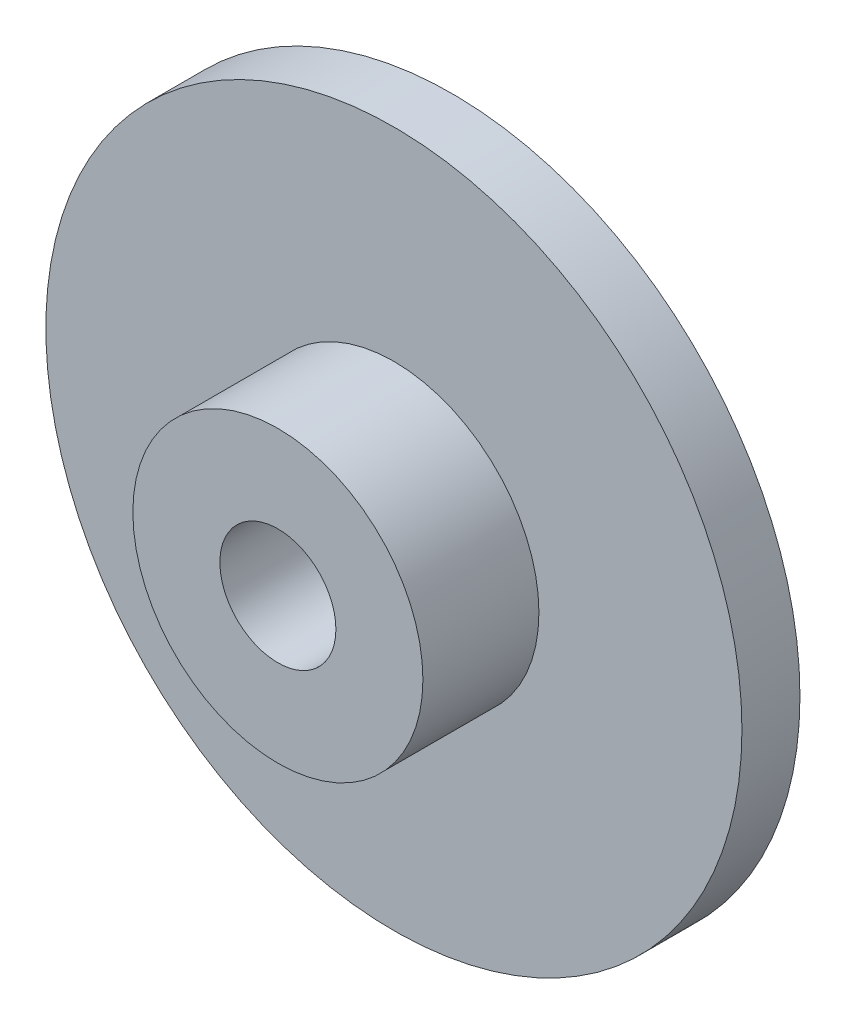
ISO-10303-21;
HEADER;
FILE_DESCRIPTION(('STEP AP214'),'2;1');
FILE_NAME('part.step','',(''),(''),'','','');
FILE_SCHEMA(('AUTOMOTIVE_DESIGN { 1 0 10303 214 1 1 1 1 }'));
ENDSEC;
DATA;
#1=APPLICATION_CONTEXT('core data for automotive mechanical design processes');
#2=APPLICATION_PROTOCOL_DEFINITION('international standard','automotive_design',2000,#1);
#3=PRODUCT_CONTEXT('',#1,'mechanical');
#4=PRODUCT('Part','Part','',(#3));
#5=PRODUCT_RELATED_PRODUCT_CATEGORY('part','',(#4));
#6=PRODUCT_DEFINITION_FORMATION('','',#4);
#7=PRODUCT_DEFINITION_CONTEXT('part definition',#1,'design');
#8=PRODUCT_DEFINITION('design','',#6,#7);
#9=PRODUCT_DEFINITION_SHAPE('','',#8);
#10=(LENGTH_UNIT() NAMED_UNIT(*) SI_UNIT(.MILLI.,.METRE.));
#11=(NAMED_UNIT(*) PLANE_ANGLE_UNIT() SI_UNIT($,.RADIAN.));
#12=(NAMED_UNIT(*) SI_UNIT($,.STERADIAN.) SOLID_ANGLE_UNIT());
#13=UNCERTAINTY_MEASURE_WITH_UNIT(LENGTH_MEASURE(1.E-05),#10,'distance_accuracy_value','');
#14=(GEOMETRIC_REPRESENTATION_CONTEXT(3) GLOBAL_UNCERTAINTY_ASSIGNED_CONTEXT((#13)) GLOBAL_UNIT_ASSIGNED_CONTEXT((#10,
#11,#12)) REPRESENTATION_CONTEXT('',''));
#15=CARTESIAN_POINT('',(0.,0.,0.));
#16=DIRECTION('',(0.,0.,1.));
#17=DIRECTION('',(1.,0.,0.));
#18=AXIS2_PLACEMENT_3D('',#15,#16,#17);
#19=CARTESIAN_POINT('',(0.,0.,3.175));
#20=DIRECTION('',(0.,0.,-1.));
#21=DIRECTION('',(-1.,0.,0.));
#22=AXIS2_PLACEMENT_3D('',#19,#20,#21);
#23=CYLINDRICAL_SURFACE('',#22,19.05);
#24=CARTESIAN_POINT('',(0.,0.,3.175));
#25=DIRECTION('',(0.,0.,1.));
#26=DIRECTION('',(1.,0.,0.));
#27=AXIS2_PLACEMENT_3D('',#24,#25,#26);
#28=CIRCLE('',#27,19.05);
#29=CARTESIAN_POINT('',(19.05,0.,3.175));
#30=VERTEX_POINT('',#29);
#31=EDGE_CURVE('E10',#30,#30,#28,.T.);
#32=ORIENTED_EDGE('',*,*,#31,.F.);
#33=EDGE_LOOP('',(#32));
#34=FACE_BOUND('',#33,.T.);
#35=CARTESIAN_POINT('',(0.,0.,0.));
#36=DIRECTION('',(0.,0.,1.));
#37=DIRECTION('',(1.,0.,0.));
#38=AXIS2_PLACEMENT_3D('',#35,#36,#37);
#39=CIRCLE('',#38,19.05);
#40=CARTESIAN_POINT('',(19.05,0.,0.));
#41=VERTEX_POINT('',#40);
#42=EDGE_CURVE('E33',#41,#41,#39,.T.);
#43=ORIENTED_EDGE('',*,*,#42,.T.);
#44=EDGE_LOOP('',(#43));
#45=FACE_BOUND('',#44,.T.);
#46=ADVANCED_FACE('F30',(#34,#45),#23,.T.);
#47=CARTESIAN_POINT('',(0.,0.,3.175));
#48=DIRECTION('',(0.,0.,1.));
#49=DIRECTION('',(1.,0.,0.));
#50=AXIS2_PLACEMENT_3D('',#47,#48,#49);
#51=PLANE('',#50);
#52=CARTESIAN_POINT('',(0.,0.,3.175));
#53=DIRECTION('',(0.,0.,1.));
#54=DIRECTION('',(1.,0.,0.));
#55=AXIS2_PLACEMENT_3D('',#52,#53,#54);
#56=CIRCLE('',#55,7.9375);
#57=CARTESIAN_POINT('',(7.9375,0.,3.175));
#58=VERTEX_POINT('',#57);
#59=EDGE_CURVE('E42',#58,#58,#56,.T.);
#60=ORIENTED_EDGE('',*,*,#59,.F.);
#61=EDGE_LOOP('',(#60));
#62=FACE_BOUND('',#61,.T.);
#63=ORIENTED_EDGE('',*,*,#31,.T.);
#64=EDGE_LOOP('',(#63));
#65=FACE_BOUND('',#64,.T.);
#66=ADVANCED_FACE('F75',(#62,#65),#51,.T.);
#67=CARTESIAN_POINT('',(0.,0.,0.));
#68=DIRECTION('',(0.,0.,1.));
#69=DIRECTION('',(1.,0.,0.));
#70=AXIS2_PLACEMENT_3D('',#67,#68,#69);
#71=PLANE('',#70);
#72=CARTESIAN_POINT('',(0.,0.,0.));
#73=DIRECTION('',(0.,0.,1.));
#74=DIRECTION('',(1.,0.,0.));
#75=AXIS2_PLACEMENT_3D('',#72,#73,#74);
#76=CIRCLE('',#75,3.175);
#77=CARTESIAN_POINT('',(3.175,0.,0.));
#78=VERTEX_POINT('',#77);
#79=EDGE_CURVE('E45',#78,#78,#76,.T.);
#80=ORIENTED_EDGE('',*,*,#79,.T.);
#81=EDGE_LOOP('',(#80));
#82=FACE_BOUND('',#81,.T.);
#83=ORIENTED_EDGE('',*,*,#42,.F.);
#84=EDGE_LOOP('',(#83));
#85=FACE_BOUND('',#84,.T.);
#86=ADVANCED_FACE('F54',(#82,#85),#71,.F.);
#87=CARTESIAN_POINT('',(0.,0.,9.525));
#88=DIRECTION('',(0.,0.,-1.));
#89=DIRECTION('',(-1.,0.,0.));
#90=AXIS2_PLACEMENT_3D('',#87,#88,#89);
#91=CYLINDRICAL_SURFACE('',#90,7.9375);
#92=CARTESIAN_POINT('',(0.,0.,9.525));
#93=DIRECTION('',(0.,0.,1.));
#94=DIRECTION('',(1.,0.,0.));
#95=AXIS2_PLACEMENT_3D('',#92,#93,#94);
#96=CIRCLE('',#95,7.9375);
#97=CARTESIAN_POINT('',(7.9375,0.,9.525));
#98=VERTEX_POINT('',#97);
#99=EDGE_CURVE('E40',#98,#98,#96,.T.);
#100=ORIENTED_EDGE('',*,*,#99,.F.);
#101=EDGE_LOOP('',(#100));
#102=FACE_BOUND('',#101,.T.);
#103=ORIENTED_EDGE('',*,*,#59,.T.);
#104=EDGE_LOOP('',(#103));
#105=FACE_BOUND('',#104,.T.);
#106=ADVANCED_FACE('F66',(#102,#105),#91,.T.);
#107=CARTESIAN_POINT('',(0.,0.,9.525));
#108=DIRECTION('',(0.,0.,1.));
#109=DIRECTION('',(1.,0.,0.));
#110=AXIS2_PLACEMENT_3D('',#107,#108,#109);
#111=PLANE('',#110);
#112=CARTESIAN_POINT('',(0.,0.,9.525));
#113=DIRECTION('',(0.,0.,1.));
#114=DIRECTION('',(1.,0.,0.));
#115=AXIS2_PLACEMENT_3D('',#112,#113,#114);
#116=CIRCLE('',#115,3.175);
#117=CARTESIAN_POINT('',(3.175,0.,9.525));
#118=VERTEX_POINT('',#117);
#119=EDGE_CURVE('E48',#118,#118,#116,.T.);
#120=ORIENTED_EDGE('',*,*,#119,.F.);
#121=EDGE_LOOP('',(#120));
#122=FACE_BOUND('',#121,.T.);
#123=ORIENTED_EDGE('',*,*,#99,.T.);
#124=EDGE_LOOP('',(#123));
#125=FACE_BOUND('',#124,.T.);
#126=ADVANCED_FACE('F60',(#122,#125),#111,.T.);
#127=CARTESIAN_POINT('',(0.,0.,0.));
#128=DIRECTION('',(0.,0.,1.));
#129=DIRECTION('',(1.,0.,0.));
#130=AXIS2_PLACEMENT_3D('',#127,#128,#129);
#131=CYLINDRICAL_SURFACE('',#130,3.175);
#132=ORIENTED_EDGE('',*,*,#79,.F.);
#133=EDGE_LOOP('',(#132));
#134=FACE_BOUND('',#133,.T.);
#135=ORIENTED_EDGE('',*,*,#119,.T.);
#136=EDGE_LOOP('',(#135));
#137=FACE_BOUND('',#136,.T.);
#138=ADVANCED_FACE('F57',(#134,#137),#131,.F.);
#139=CLOSED_SHELL('',(#46,#66,#86,#106,#126,#138));
#140=MANIFOLD_SOLID_BREP('B2',#139);
#141=ADVANCED_BREP_SHAPE_REPRESENTATION('',(#18,#140),#14);
#142=SHAPE_DEFINITION_REPRESENTATION(#9,#141);
ENDSEC;
END-ISO-10303-21;
